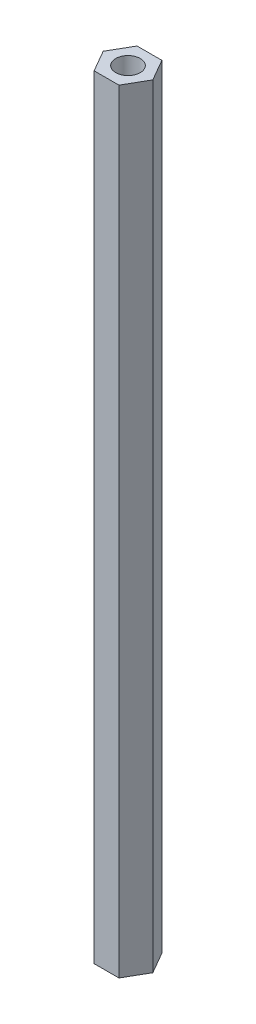
ISO-10303-21;
HEADER;
FILE_DESCRIPTION(('STEP AP214'),'2;1');
FILE_NAME('part.step','',(''),(''),'','','');
FILE_SCHEMA(('AUTOMOTIVE_DESIGN { 1 0 10303 214 1 1 1 1 }'));
ENDSEC;
DATA;
#1=APPLICATION_CONTEXT('core data for automotive mechanical design processes');
#2=APPLICATION_PROTOCOL_DEFINITION('international standard','automotive_design',2000,#1);
#3=PRODUCT_CONTEXT('',#1,'mechanical');
#4=PRODUCT('Part','Part','',(#3));
#5=PRODUCT_RELATED_PRODUCT_CATEGORY('part','',(#4));
#6=PRODUCT_DEFINITION_FORMATION('','',#4);
#7=PRODUCT_DEFINITION_CONTEXT('part definition',#1,'design');
#8=PRODUCT_DEFINITION('design','',#6,#7);
#9=PRODUCT_DEFINITION_SHAPE('','',#8);
#10=(LENGTH_UNIT() NAMED_UNIT(*) SI_UNIT(.MILLI.,.METRE.));
#11=(NAMED_UNIT(*) PLANE_ANGLE_UNIT() SI_UNIT($,.RADIAN.));
#12=(NAMED_UNIT(*) SI_UNIT($,.STERADIAN.) SOLID_ANGLE_UNIT());
#13=UNCERTAINTY_MEASURE_WITH_UNIT(LENGTH_MEASURE(1.E-05),#10,'distance_accuracy_value','');
#14=(GEOMETRIC_REPRESENTATION_CONTEXT(3) GLOBAL_UNCERTAINTY_ASSIGNED_CONTEXT((#13)) GLOBAL_UNIT_ASSIGNED_CONTEXT((#10,
#11,#12)) REPRESENTATION_CONTEXT('',''));
#15=CARTESIAN_POINT('',(0.,0.,0.));
#16=DIRECTION('',(0.,0.,1.));
#17=DIRECTION('',(1.,0.,0.));
#18=AXIS2_PLACEMENT_3D('',#15,#16,#17);
#19=CARTESIAN_POINT('',(0.,126.,0.));
#20=DIRECTION('',(0.,1.,0.));
#21=DIRECTION('',(0.,0.,1.));
#22=AXIS2_PLACEMENT_3D('',#19,#20,#21);
#23=PLANE('',#22);
#24=DIRECTION('',(0.499999999999999,0.,-0.866025403784439));
#25=VECTOR('',#24,1.);
#26=CARTESIAN_POINT('',(2.02072594216369,126.,3.5));
#27=LINE('',#26,#25);
#28=CARTESIAN_POINT('',(2.02072594216369,126.,3.5));
#29=VERTEX_POINT('',#28);
#30=CARTESIAN_POINT('',(4.04145188432738,126.,0.));
#31=VERTEX_POINT('',#30);
#32=EDGE_CURVE('E152',#29,#31,#27,.T.);
#33=ORIENTED_EDGE('',*,*,#32,.T.);
#34=DIRECTION('',(-0.5,0.,-0.866025403784438));
#35=VECTOR('',#34,1.);
#36=CARTESIAN_POINT('',(4.04145188432738,126.,0.));
#37=LINE('',#36,#35);
#38=CARTESIAN_POINT('',(2.02072594216369,126.,-3.5));
#39=VERTEX_POINT('',#38);
#40=EDGE_CURVE('E100',#31,#39,#37,.T.);
#41=ORIENTED_EDGE('',*,*,#40,.T.);
#42=DIRECTION('',(-1.,0.,0.));
#43=VECTOR('',#42,1.);
#44=CARTESIAN_POINT('',(2.02072594216369,126.,-3.5));
#45=LINE('',#44,#43);
#46=CARTESIAN_POINT('',(-2.02072594216369,126.,-3.5));
#47=VERTEX_POINT('',#46);
#48=EDGE_CURVE('E113',#39,#47,#45,.T.);
#49=ORIENTED_EDGE('',*,*,#48,.T.);
#50=DIRECTION('',(-0.5,0.,0.866025403784439));
#51=VECTOR('',#50,1.);
#52=CARTESIAN_POINT('',(-2.02072594216369,126.,-3.5));
#53=LINE('',#52,#51);
#54=CARTESIAN_POINT('',(-4.04145188432738,126.,0.));
#55=VERTEX_POINT('',#54);
#56=EDGE_CURVE('E107',#47,#55,#53,.T.);
#57=ORIENTED_EDGE('',*,*,#56,.T.);
#58=DIRECTION('',(0.5,0.,0.866025403784439));
#59=VECTOR('',#58,1.);
#60=CARTESIAN_POINT('',(-4.04145188432738,126.,0.));
#61=LINE('',#60,#59);
#62=CARTESIAN_POINT('',(-2.02072594216369,126.,3.5));
#63=VERTEX_POINT('',#62);
#64=EDGE_CURVE('E111',#55,#63,#61,.T.);
#65=ORIENTED_EDGE('',*,*,#64,.T.);
#66=DIRECTION('',(1.,0.,0.));
#67=VECTOR('',#66,1.);
#68=CARTESIAN_POINT('',(-2.02072594216369,126.,3.5));
#69=LINE('',#68,#67);
#70=EDGE_CURVE('E63',#63,#29,#69,.T.);
#71=ORIENTED_EDGE('',*,*,#70,.T.);
#72=EDGE_LOOP('',(#33,#41,#49,#57,#65,#71));
#73=FACE_BOUND('',#72,.T.);
#74=CARTESIAN_POINT('',(0.,126.,0.));
#75=DIRECTION('',(0.,1.,0.));
#76=DIRECTION('',(0.,0.,1.));
#77=AXIS2_PLACEMENT_3D('',#74,#75,#76);
#78=CIRCLE('',#77,2.);
#79=CARTESIAN_POINT('',(0.,126.,2.));
#80=VERTEX_POINT('',#79);
#81=EDGE_CURVE('E140',#80,#80,#78,.T.);
#82=ORIENTED_EDGE('',*,*,#81,.F.);
#83=EDGE_LOOP('',(#82));
#84=FACE_BOUND('',#83,.T.);
#85=ADVANCED_FACE('F45',(#73,#84),#23,.T.);
#86=CARTESIAN_POINT('',(0.,0.,0.));
#87=DIRECTION('',(0.,1.,0.));
#88=DIRECTION('',(0.,0.,1.));
#89=AXIS2_PLACEMENT_3D('',#86,#87,#88);
#90=PLANE('',#89);
#91=DIRECTION('',(0.499999999999999,0.,-0.866025403784439));
#92=VECTOR('',#91,1.);
#93=CARTESIAN_POINT('',(2.02072594216369,0.,3.5));
#94=LINE('',#93,#92);
#95=CARTESIAN_POINT('',(2.02072594216369,0.,3.5));
#96=VERTEX_POINT('',#95);
#97=CARTESIAN_POINT('',(4.04145188432738,0.,0.));
#98=VERTEX_POINT('',#97);
#99=EDGE_CURVE('E135',#96,#98,#94,.T.);
#100=ORIENTED_EDGE('',*,*,#99,.F.);
#101=DIRECTION('',(1.,0.,0.));
#102=VECTOR('',#101,1.);
#103=CARTESIAN_POINT('',(-2.02072594216369,0.,3.5));
#104=LINE('',#103,#102);
#105=CARTESIAN_POINT('',(-2.02072594216369,0.,3.5));
#106=VERTEX_POINT('',#105);
#107=EDGE_CURVE('E92',#106,#96,#104,.T.);
#108=ORIENTED_EDGE('',*,*,#107,.F.);
#109=DIRECTION('',(0.5,0.,0.866025403784439));
#110=VECTOR('',#109,1.);
#111=CARTESIAN_POINT('',(-4.04145188432738,0.,0.));
#112=LINE('',#111,#110);
#113=CARTESIAN_POINT('',(-4.04145188432738,0.,0.));
#114=VERTEX_POINT('',#113);
#115=EDGE_CURVE('E86',#114,#106,#112,.T.);
#116=ORIENTED_EDGE('',*,*,#115,.F.);
#117=DIRECTION('',(-0.5,0.,0.866025403784439));
#118=VECTOR('',#117,1.);
#119=CARTESIAN_POINT('',(-2.02072594216369,0.,-3.5));
#120=LINE('',#119,#118);
#121=CARTESIAN_POINT('',(-2.02072594216369,0.,-3.5));
#122=VERTEX_POINT('',#121);
#123=EDGE_CURVE('E122',#122,#114,#120,.T.);
#124=ORIENTED_EDGE('',*,*,#123,.F.);
#125=DIRECTION('',(-1.,0.,0.));
#126=VECTOR('',#125,1.);
#127=CARTESIAN_POINT('',(2.02072594216369,0.,-3.5));
#128=LINE('',#127,#126);
#129=CARTESIAN_POINT('',(2.02072594216369,0.,-3.5));
#130=VERTEX_POINT('',#129);
#131=EDGE_CURVE('E143',#130,#122,#128,.T.);
#132=ORIENTED_EDGE('',*,*,#131,.F.);
#133=DIRECTION('',(-0.5,0.,-0.866025403784438));
#134=VECTOR('',#133,1.);
#135=CARTESIAN_POINT('',(4.04145188432738,0.,0.));
#136=LINE('',#135,#134);
#137=EDGE_CURVE('E139',#98,#130,#136,.T.);
#138=ORIENTED_EDGE('',*,*,#137,.F.);
#139=EDGE_LOOP('',(#100,#108,#116,#124,#132,#138));
#140=FACE_BOUND('',#139,.T.);
#141=CARTESIAN_POINT('',(0.,0.,0.));
#142=DIRECTION('',(0.,1.,0.));
#143=DIRECTION('',(0.,0.,1.));
#144=AXIS2_PLACEMENT_3D('',#141,#142,#143);
#145=CIRCLE('',#144,2.);
#146=CARTESIAN_POINT('',(0.,0.,2.));
#147=VERTEX_POINT('',#146);
#148=EDGE_CURVE('E249',#147,#147,#145,.T.);
#149=ORIENTED_EDGE('',*,*,#148,.T.);
#150=EDGE_LOOP('',(#149));
#151=FACE_BOUND('',#150,.T.);
#152=ADVANCED_FACE('F165',(#140,#151),#90,.F.);
#153=CARTESIAN_POINT('',(2.02072594216369,126.,3.5));
#154=DIRECTION('',(-0.866025403784439,0.,-0.499999999999999));
#155=DIRECTION('',(-0.499999999999999,0.,0.866025403784439));
#156=AXIS2_PLACEMENT_3D('',#153,#154,#155);
#157=PLANE('',#156);
#158=ORIENTED_EDGE('',*,*,#99,.T.);
#159=DIRECTION('',(0.,-1.,0.));
#160=VECTOR('',#159,1.);
#161=CARTESIAN_POINT('',(4.04145188432738,126.,0.));
#162=LINE('',#161,#160);
#163=EDGE_CURVE('E11',#31,#98,#162,.T.);
#164=ORIENTED_EDGE('',*,*,#163,.F.);
#165=ORIENTED_EDGE('',*,*,#32,.F.);
#166=DIRECTION('',(0.,-1.,0.));
#167=VECTOR('',#166,1.);
#168=CARTESIAN_POINT('',(2.02072594216369,126.,3.5));
#169=LINE('',#168,#167);
#170=EDGE_CURVE('E131',#29,#96,#169,.T.);
#171=ORIENTED_EDGE('',*,*,#170,.T.);
#172=EDGE_LOOP('',(#158,#164,#165,#171));
#173=FACE_BOUND('',#172,.T.);
#174=ADVANCED_FACE('F47',(#173),#157,.F.);
#175=CARTESIAN_POINT('',(4.04145188432738,126.,0.));
#176=DIRECTION('',(-0.866025403784438,0.,0.5));
#177=DIRECTION('',(0.5,0.,0.866025403784439));
#178=AXIS2_PLACEMENT_3D('',#175,#176,#177);
#179=PLANE('',#178);
#180=ORIENTED_EDGE('',*,*,#137,.T.);
#181=DIRECTION('',(0.,-1.,0.));
#182=VECTOR('',#181,1.);
#183=CARTESIAN_POINT('',(2.02072594216369,126.,-3.5));
#184=LINE('',#183,#182);
#185=EDGE_CURVE('E55',#39,#130,#184,.T.);
#186=ORIENTED_EDGE('',*,*,#185,.F.);
#187=ORIENTED_EDGE('',*,*,#40,.F.);
#188=ORIENTED_EDGE('',*,*,#163,.T.);
#189=EDGE_LOOP('',(#180,#186,#187,#188));
#190=FACE_BOUND('',#189,.T.);
#191=ADVANCED_FACE('F190',(#190),#179,.F.);
#192=CARTESIAN_POINT('',(2.02072594216369,126.,-3.5));
#193=DIRECTION('',(0.,0.,1.));
#194=DIRECTION('',(1.,0.,0.));
#195=AXIS2_PLACEMENT_3D('',#192,#193,#194);
#196=PLANE('',#195);
#197=ORIENTED_EDGE('',*,*,#131,.T.);
#198=DIRECTION('',(0.,-1.,0.));
#199=VECTOR('',#198,1.);
#200=CARTESIAN_POINT('',(-2.02072594216369,126.,-3.5));
#201=LINE('',#200,#199);
#202=EDGE_CURVE('E124',#47,#122,#201,.T.);
#203=ORIENTED_EDGE('',*,*,#202,.F.);
#204=ORIENTED_EDGE('',*,*,#48,.F.);
#205=ORIENTED_EDGE('',*,*,#185,.T.);
#206=EDGE_LOOP('',(#197,#203,#204,#205));
#207=FACE_BOUND('',#206,.T.);
#208=ADVANCED_FACE('F162',(#207),#196,.F.);
#209=CARTESIAN_POINT('',(-2.02072594216369,126.,-3.5));
#210=DIRECTION('',(0.866025403784439,0.,0.499999999999999));
#211=DIRECTION('',(0.5,0.,-0.866025403784439));
#212=AXIS2_PLACEMENT_3D('',#209,#210,#211);
#213=PLANE('',#212);
#214=ORIENTED_EDGE('',*,*,#123,.T.);
#215=DIRECTION('',(0.,-1.,0.));
#216=VECTOR('',#215,1.);
#217=CARTESIAN_POINT('',(-4.04145188432738,126.,0.));
#218=LINE('',#217,#216);
#219=EDGE_CURVE('E119',#55,#114,#218,.T.);
#220=ORIENTED_EDGE('',*,*,#219,.F.);
#221=ORIENTED_EDGE('',*,*,#56,.F.);
#222=ORIENTED_EDGE('',*,*,#202,.T.);
#223=EDGE_LOOP('',(#214,#220,#221,#222));
#224=FACE_BOUND('',#223,.T.);
#225=ADVANCED_FACE('F120',(#224),#213,.F.);
#226=CARTESIAN_POINT('',(-4.04145188432738,126.,0.));
#227=DIRECTION('',(0.866025403784439,0.,-0.5));
#228=DIRECTION('',(-0.5,0.,-0.866025403784438));
#229=AXIS2_PLACEMENT_3D('',#226,#227,#228);
#230=PLANE('',#229);
#231=ORIENTED_EDGE('',*,*,#115,.T.);
#232=DIRECTION('',(0.,-1.,0.));
#233=VECTOR('',#232,1.);
#234=CARTESIAN_POINT('',(-2.02072594216369,126.,3.5));
#235=LINE('',#234,#233);
#236=EDGE_CURVE('E125',#63,#106,#235,.T.);
#237=ORIENTED_EDGE('',*,*,#236,.F.);
#238=ORIENTED_EDGE('',*,*,#64,.F.);
#239=ORIENTED_EDGE('',*,*,#219,.T.);
#240=EDGE_LOOP('',(#231,#237,#238,#239));
#241=FACE_BOUND('',#240,.T.);
#242=ADVANCED_FACE('F127',(#241),#230,.F.);
#243=CARTESIAN_POINT('',(-2.02072594216369,126.,3.5));
#244=DIRECTION('',(0.,0.,-1.));
#245=DIRECTION('',(-1.,0.,0.));
#246=AXIS2_PLACEMENT_3D('',#243,#244,#245);
#247=PLANE('',#246);
#248=ORIENTED_EDGE('',*,*,#107,.T.);
#249=ORIENTED_EDGE('',*,*,#170,.F.);
#250=ORIENTED_EDGE('',*,*,#70,.F.);
#251=ORIENTED_EDGE('',*,*,#236,.T.);
#252=EDGE_LOOP('',(#248,#249,#250,#251));
#253=FACE_BOUND('',#252,.T.);
#254=ADVANCED_FACE('F170',(#253),#247,.F.);
#255=CARTESIAN_POINT('',(0.,126.,0.));
#256=DIRECTION('',(0.,-1.,0.));
#257=DIRECTION('',(0.,0.,-1.));
#258=AXIS2_PLACEMENT_3D('',#255,#256,#257);
#259=CYLINDRICAL_SURFACE('',#258,2.);
#260=ORIENTED_EDGE('',*,*,#81,.T.);
#261=EDGE_LOOP('',(#260));
#262=FACE_BOUND('',#261,.T.);
#263=ORIENTED_EDGE('',*,*,#148,.F.);
#264=EDGE_LOOP('',(#263));
#265=FACE_BOUND('',#264,.T.);
#266=ADVANCED_FACE('F172',(#262,#265),#259,.F.);
#267=CLOSED_SHELL('',(#85,#152,#174,#191,#208,#225,#242,#254,#266));
#268=MANIFOLD_SOLID_BREP('B2',#267);
#269=ADVANCED_BREP_SHAPE_REPRESENTATION('',(#18,#268),#14);
#270=SHAPE_DEFINITION_REPRESENTATION(#9,#269);
ENDSEC;
END-ISO-10303-21;
